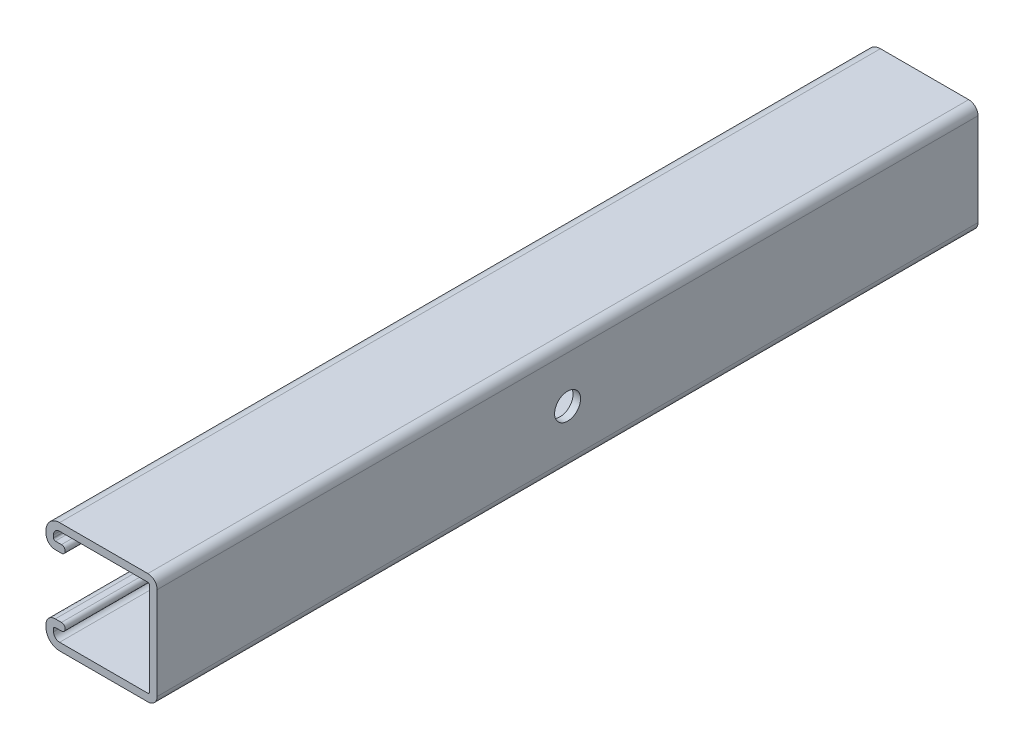
ISO-10303-21;
HEADER;
FILE_DESCRIPTION(('STEP AP214'),'2;1');
FILE_NAME('part.step','',(''),(''),'','','');
FILE_SCHEMA(('AUTOMOTIVE_DESIGN { 1 0 10303 214 1 1 1 1 }'));
ENDSEC;
DATA;
#1=APPLICATION_CONTEXT('core data for automotive mechanical design processes');
#2=APPLICATION_PROTOCOL_DEFINITION('international standard','automotive_design',2000,#1);
#3=PRODUCT_CONTEXT('',#1,'mechanical');
#4=PRODUCT('Part','Part','',(#3));
#5=PRODUCT_RELATED_PRODUCT_CATEGORY('part','',(#4));
#6=PRODUCT_DEFINITION_FORMATION('','',#4);
#7=PRODUCT_DEFINITION_CONTEXT('part definition',#1,'design');
#8=PRODUCT_DEFINITION('design','',#6,#7);
#9=PRODUCT_DEFINITION_SHAPE('','',#8);
#10=(LENGTH_UNIT() NAMED_UNIT(*) SI_UNIT(.MILLI.,.METRE.));
#11=(NAMED_UNIT(*) PLANE_ANGLE_UNIT() SI_UNIT($,.RADIAN.));
#12=(NAMED_UNIT(*) SI_UNIT($,.STERADIAN.) SOLID_ANGLE_UNIT());
#13=UNCERTAINTY_MEASURE_WITH_UNIT(LENGTH_MEASURE(1.E-05),#10,'distance_accuracy_value','');
#14=(GEOMETRIC_REPRESENTATION_CONTEXT(3) GLOBAL_UNCERTAINTY_ASSIGNED_CONTEXT((#13)) GLOBAL_UNIT_ASSIGNED_CONTEXT((#10,
#11,#12)) REPRESENTATION_CONTEXT('',''));
#15=CARTESIAN_POINT('',(0.,0.,0.));
#16=DIRECTION('',(0.,0.,1.));
#17=DIRECTION('',(1.,0.,0.));
#18=AXIS2_PLACEMENT_3D('',#15,#16,#17);
#19=CARTESIAN_POINT('',(-36.22675,15.58925,-304.8));
#20=DIRECTION('',(0.,0.,1.));
#21=DIRECTION('',(1.,0.,0.));
#22=AXIS2_PLACEMENT_3D('',#19,#20,#21);
#23=CYLINDRICAL_SURFACE('',#22,5.04825);
#24=CARTESIAN_POINT('',(-36.22675,15.58925,0.));
#25=DIRECTION('',(0.,0.,1.));
#26=DIRECTION('',(1.,0.,0.));
#27=AXIS2_PLACEMENT_3D('',#24,#25,#26);
#28=CIRCLE('',#27,5.04825);
#29=CARTESIAN_POINT('',(-36.22675,20.6375,0.));
#30=VERTEX_POINT('',#29);
#31=CARTESIAN_POINT('',(-41.275,15.58925,0.));
#32=VERTEX_POINT('',#31);
#33=EDGE_CURVE('E252',#30,#32,#28,.T.);
#34=ORIENTED_EDGE('',*,*,#33,.F.);
#35=DIRECTION('',(0.,0.,1.));
#36=VECTOR('',#35,1.);
#37=CARTESIAN_POINT('',(-36.22675,20.6375,-304.8));
#38=LINE('',#37,#36);
#39=CARTESIAN_POINT('',(-36.22675,20.6375,-304.8));
#40=VERTEX_POINT('',#39);
#41=EDGE_CURVE('E11',#40,#30,#38,.T.);
#42=ORIENTED_EDGE('',*,*,#41,.F.);
#43=CARTESIAN_POINT('',(-36.22675,15.58925,-304.8));
#44=DIRECTION('',(0.,0.,1.));
#45=DIRECTION('',(1.,0.,0.));
#46=AXIS2_PLACEMENT_3D('',#43,#44,#45);
#47=CIRCLE('',#46,5.04825);
#48=CARTESIAN_POINT('',(-41.275,15.58925,-304.8));
#49=VERTEX_POINT('',#48);
#50=EDGE_CURVE('E332',#40,#49,#47,.T.);
#51=ORIENTED_EDGE('',*,*,#50,.T.);
#52=DIRECTION('',(0.,0.,1.));
#53=VECTOR('',#52,1.);
#54=CARTESIAN_POINT('',(-41.275,15.58925,-304.8));
#55=LINE('',#54,#53);
#56=EDGE_CURVE('E150',#49,#32,#55,.T.);
#57=ORIENTED_EDGE('',*,*,#56,.T.);
#58=EDGE_LOOP('',(#34,#42,#51,#57));
#59=FACE_BOUND('',#58,.T.);
#60=ADVANCED_FACE('F34',(#59),#23,.T.);
#61=CARTESIAN_POINT('',(-36.22675,20.6375,-304.8));
#62=DIRECTION('',(0.,1.,0.));
#63=DIRECTION('',(-1.,0.,0.));
#64=AXIS2_PLACEMENT_3D('',#61,#62,#63);
#65=PLANE('',#64);
#66=DIRECTION('',(-1.,0.,0.));
#67=VECTOR('',#66,1.);
#68=CARTESIAN_POINT('',(-36.22675,20.6375,0.));
#69=LINE('',#68,#67);
#70=CARTESIAN_POINT('',(-3.46075,20.6375,0.));
#71=VERTEX_POINT('',#70);
#72=EDGE_CURVE('E330',#71,#30,#69,.T.);
#73=ORIENTED_EDGE('',*,*,#72,.F.);
#74=DIRECTION('',(0.,0.,1.));
#75=VECTOR('',#74,1.);
#76=CARTESIAN_POINT('',(-3.46075,20.6375,-304.8));
#77=LINE('',#76,#75);
#78=CARTESIAN_POINT('',(-3.46075,20.6375,-304.8));
#79=VERTEX_POINT('',#78);
#80=EDGE_CURVE('E43',#79,#71,#77,.T.);
#81=ORIENTED_EDGE('',*,*,#80,.F.);
#82=DIRECTION('',(-1.,0.,0.));
#83=VECTOR('',#82,1.);
#84=CARTESIAN_POINT('',(-36.22675,20.6375,-304.8));
#85=LINE('',#84,#83);
#86=EDGE_CURVE('E242',#79,#40,#85,.T.);
#87=ORIENTED_EDGE('',*,*,#86,.T.);
#88=ORIENTED_EDGE('',*,*,#41,.T.);
#89=EDGE_LOOP('',(#73,#81,#87,#88));
#90=FACE_BOUND('',#89,.T.);
#91=ADVANCED_FACE('F385',(#90),#65,.T.);
#92=CARTESIAN_POINT('',(-3.46075,17.17675,-304.8));
#93=DIRECTION('',(0.,0.,1.));
#94=DIRECTION('',(1.,0.,0.));
#95=AXIS2_PLACEMENT_3D('',#92,#93,#94);
#96=CYLINDRICAL_SURFACE('',#95,3.46075);
#97=CARTESIAN_POINT('',(-3.46075,17.17675,0.));
#98=DIRECTION('',(0.,0.,1.));
#99=DIRECTION('',(1.,0.,0.));
#100=AXIS2_PLACEMENT_3D('',#97,#98,#99);
#101=CIRCLE('',#100,3.46075);
#102=CARTESIAN_POINT('',(0.,17.17675,0.));
#103=VERTEX_POINT('',#102);
#104=EDGE_CURVE('E229',#103,#71,#101,.T.);
#105=ORIENTED_EDGE('',*,*,#104,.F.);
#106=DIRECTION('',(0.,0.,1.));
#107=VECTOR('',#106,1.);
#108=CARTESIAN_POINT('',(0.,17.17675,-304.8));
#109=LINE('',#108,#107);
#110=CARTESIAN_POINT('',(0.,17.17675,-304.8));
#111=VERTEX_POINT('',#110);
#112=EDGE_CURVE('E224',#111,#103,#109,.T.);
#113=ORIENTED_EDGE('',*,*,#112,.F.);
#114=CARTESIAN_POINT('',(-3.46075,17.17675,-304.8));
#115=DIRECTION('',(0.,0.,1.));
#116=DIRECTION('',(1.,0.,0.));
#117=AXIS2_PLACEMENT_3D('',#114,#115,#116);
#118=CIRCLE('',#117,3.46075);
#119=EDGE_CURVE('E227',#111,#79,#118,.T.);
#120=ORIENTED_EDGE('',*,*,#119,.T.);
#121=ORIENTED_EDGE('',*,*,#80,.T.);
#122=EDGE_LOOP('',(#105,#113,#120,#121));
#123=FACE_BOUND('',#122,.T.);
#124=ADVANCED_FACE('F226',(#123),#96,.T.);
#125=CARTESIAN_POINT('',(0.,17.17675,-304.8));
#126=DIRECTION('',(1.,0.,0.));
#127=DIRECTION('',(0.,1.,0.));
#128=AXIS2_PLACEMENT_3D('',#125,#126,#127);
#129=PLANE('',#128);
#130=CARTESIAN_POINT('',(0.,0.,-152.4));
#131=DIRECTION('',(1.,0.,0.));
#132=DIRECTION('',(0.,1.,0.));
#133=AXIS2_PLACEMENT_3D('',#130,#131,#132);
#134=CIRCLE('',#133,4.82599999999999);
#135=CARTESIAN_POINT('',(0.,4.82599999999999,-152.4));
#136=VERTEX_POINT('',#135);
#137=EDGE_CURVE('E508',#136,#136,#134,.T.);
#138=ORIENTED_EDGE('',*,*,#137,.F.);
#139=EDGE_LOOP('',(#138));
#140=FACE_BOUND('',#139,.T.);
#141=DIRECTION('',(0.,1.,0.));
#142=VECTOR('',#141,1.);
#143=CARTESIAN_POINT('',(0.,17.17675,0.));
#144=LINE('',#143,#142);
#145=CARTESIAN_POINT('',(0.,-17.17675,0.));
#146=VERTEX_POINT('',#145);
#147=EDGE_CURVE('E327',#146,#103,#144,.T.);
#148=ORIENTED_EDGE('',*,*,#147,.F.);
#149=DIRECTION('',(0.,0.,1.));
#150=VECTOR('',#149,1.);
#151=CARTESIAN_POINT('',(0.,-17.17675,-304.8));
#152=LINE('',#151,#150);
#153=CARTESIAN_POINT('',(0.,-17.17675,-304.8));
#154=VERTEX_POINT('',#153);
#155=EDGE_CURVE('E234',#154,#146,#152,.T.);
#156=ORIENTED_EDGE('',*,*,#155,.F.);
#157=DIRECTION('',(0.,1.,0.));
#158=VECTOR('',#157,1.);
#159=CARTESIAN_POINT('',(0.,17.17675,-304.8));
#160=LINE('',#159,#158);
#161=EDGE_CURVE('E240',#154,#111,#160,.T.);
#162=ORIENTED_EDGE('',*,*,#161,.T.);
#163=ORIENTED_EDGE('',*,*,#112,.T.);
#164=EDGE_LOOP('',(#148,#156,#162,#163));
#165=FACE_BOUND('',#164,.T.);
#166=ADVANCED_FACE('F244',(#140,#165),#129,.T.);
#167=CARTESIAN_POINT('',(-3.46075,-17.17675,-304.8));
#168=DIRECTION('',(0.,0.,1.));
#169=DIRECTION('',(1.,0.,0.));
#170=AXIS2_PLACEMENT_3D('',#167,#168,#169);
#171=CYLINDRICAL_SURFACE('',#170,3.46075);
#172=CARTESIAN_POINT('',(-3.46075,-17.17675,0.));
#173=DIRECTION('',(0.,0.,1.));
#174=DIRECTION('',(-1.,0.,0.));
#175=AXIS2_PLACEMENT_3D('',#172,#173,#174);
#176=CIRCLE('',#175,3.46075);
#177=CARTESIAN_POINT('',(-3.46075,-20.6375,0.));
#178=VERTEX_POINT('',#177);
#179=EDGE_CURVE('E324',#178,#146,#176,.T.);
#180=ORIENTED_EDGE('',*,*,#179,.F.);
#181=DIRECTION('',(0.,0.,1.));
#182=VECTOR('',#181,1.);
#183=CARTESIAN_POINT('',(-3.46075,-20.6375,-304.8));
#184=LINE('',#183,#182);
#185=CARTESIAN_POINT('',(-3.46075,-20.6375,-304.8));
#186=VERTEX_POINT('',#185);
#187=EDGE_CURVE('E336',#186,#178,#184,.T.);
#188=ORIENTED_EDGE('',*,*,#187,.F.);
#189=CARTESIAN_POINT('',(-3.46075,-17.17675,-304.8));
#190=DIRECTION('',(0.,0.,1.));
#191=DIRECTION('',(-1.,0.,0.));
#192=AXIS2_PLACEMENT_3D('',#189,#190,#191);
#193=CIRCLE('',#192,3.46075);
#194=EDGE_CURVE('E245',#186,#154,#193,.T.);
#195=ORIENTED_EDGE('',*,*,#194,.T.);
#196=ORIENTED_EDGE('',*,*,#155,.T.);
#197=EDGE_LOOP('',(#180,#188,#195,#196));
#198=FACE_BOUND('',#197,.T.);
#199=ADVANCED_FACE('F398',(#198),#171,.T.);
#200=CARTESIAN_POINT('',(-36.22675,-20.6375,-304.8));
#201=DIRECTION('',(0.,-1.,0.));
#202=DIRECTION('',(1.,0.,0.));
#203=AXIS2_PLACEMENT_3D('',#200,#201,#202);
#204=PLANE('',#203);
#205=DIRECTION('',(1.,0.,0.));
#206=VECTOR('',#205,1.);
#207=CARTESIAN_POINT('',(-36.22675,-20.6375,0.));
#208=LINE('',#207,#206);
#209=CARTESIAN_POINT('',(-36.22675,-20.6375,0.));
#210=VERTEX_POINT('',#209);
#211=EDGE_CURVE('E321',#210,#178,#208,.T.);
#212=ORIENTED_EDGE('',*,*,#211,.F.);
#213=DIRECTION('',(0.,0.,1.));
#214=VECTOR('',#213,1.);
#215=CARTESIAN_POINT('',(-36.22675,-20.6375,-304.8));
#216=LINE('',#215,#214);
#217=CARTESIAN_POINT('',(-36.22675,-20.6375,-304.8));
#218=VERTEX_POINT('',#217);
#219=EDGE_CURVE('E338',#218,#210,#216,.T.);
#220=ORIENTED_EDGE('',*,*,#219,.F.);
#221=DIRECTION('',(1.,0.,0.));
#222=VECTOR('',#221,1.);
#223=CARTESIAN_POINT('',(-36.22675,-20.6375,-304.8));
#224=LINE('',#223,#222);
#225=EDGE_CURVE('E247',#218,#186,#224,.T.);
#226=ORIENTED_EDGE('',*,*,#225,.T.);
#227=ORIENTED_EDGE('',*,*,#187,.T.);
#228=EDGE_LOOP('',(#212,#220,#226,#227));
#229=FACE_BOUND('',#228,.T.);
#230=ADVANCED_FACE('F402',(#229),#204,.T.);
#231=CARTESIAN_POINT('',(-36.22675,-15.58925,-304.8));
#232=DIRECTION('',(0.,0.,1.));
#233=DIRECTION('',(1.,0.,0.));
#234=AXIS2_PLACEMENT_3D('',#231,#232,#233);
#235=CYLINDRICAL_SURFACE('',#234,5.04825);
#236=CARTESIAN_POINT('',(-36.22675,-15.58925,0.));
#237=DIRECTION('',(0.,0.,1.));
#238=DIRECTION('',(-1.,0.,0.));
#239=AXIS2_PLACEMENT_3D('',#236,#237,#238);
#240=CIRCLE('',#239,5.04825);
#241=CARTESIAN_POINT('',(-41.275,-15.58925,0.));
#242=VERTEX_POINT('',#241);
#243=EDGE_CURVE('E318',#242,#210,#240,.T.);
#244=ORIENTED_EDGE('',*,*,#243,.F.);
#245=DIRECTION('',(0.,0.,1.));
#246=VECTOR('',#245,1.);
#247=CARTESIAN_POINT('',(-41.275,-15.58925,-304.8));
#248=LINE('',#247,#246);
#249=CARTESIAN_POINT('',(-41.275,-15.58925,-304.8));
#250=VERTEX_POINT('',#249);
#251=EDGE_CURVE('E340',#250,#242,#248,.T.);
#252=ORIENTED_EDGE('',*,*,#251,.F.);
#253=CARTESIAN_POINT('',(-36.22675,-15.58925,-304.8));
#254=DIRECTION('',(0.,0.,1.));
#255=DIRECTION('',(-1.,0.,0.));
#256=AXIS2_PLACEMENT_3D('',#253,#254,#255);
#257=CIRCLE('',#256,5.04825);
#258=EDGE_CURVE('E574',#250,#218,#257,.T.);
#259=ORIENTED_EDGE('',*,*,#258,.T.);
#260=ORIENTED_EDGE('',*,*,#219,.T.);
#261=EDGE_LOOP('',(#244,#252,#259,#260));
#262=FACE_BOUND('',#261,.T.);
#263=ADVANCED_FACE('F406',(#262),#235,.T.);
#264=CARTESIAN_POINT('',(-41.275,-15.58925,-304.8));
#265=DIRECTION('',(-1.,0.,0.));
#266=DIRECTION('',(0.,0.,1.));
#267=AXIS2_PLACEMENT_3D('',#264,#265,#266);
#268=PLANE('',#267);
#269=DIRECTION('',(0.,-1.,0.));
#270=VECTOR('',#269,1.);
#271=CARTESIAN_POINT('',(-41.275,-15.58925,0.));
#272=LINE('',#271,#270);
#273=CARTESIAN_POINT('',(-41.275,-14.57325,0.));
#274=VERTEX_POINT('',#273);
#275=EDGE_CURVE('E315',#274,#242,#272,.T.);
#276=ORIENTED_EDGE('',*,*,#275,.F.);
#277=DIRECTION('',(0.,0.,1.));
#278=VECTOR('',#277,1.);
#279=CARTESIAN_POINT('',(-41.275,-14.57325,-304.8));
#280=LINE('',#279,#278);
#281=CARTESIAN_POINT('',(-41.275,-14.57325,-304.8));
#282=VERTEX_POINT('',#281);
#283=EDGE_CURVE('E342',#282,#274,#280,.T.);
#284=ORIENTED_EDGE('',*,*,#283,.F.);
#285=DIRECTION('',(0.,-1.,0.));
#286=VECTOR('',#285,1.);
#287=CARTESIAN_POINT('',(-41.275,-15.58925,-304.8));
#288=LINE('',#287,#286);
#289=EDGE_CURVE('E571',#282,#250,#288,.T.);
#290=ORIENTED_EDGE('',*,*,#289,.T.);
#291=ORIENTED_EDGE('',*,*,#251,.T.);
#292=EDGE_LOOP('',(#276,#284,#290,#291));
#293=FACE_BOUND('',#292,.T.);
#294=ADVANCED_FACE('F410',(#293),#268,.T.);
#295=CARTESIAN_POINT('',(-37.81425,-14.57325,-304.8));
#296=DIRECTION('',(0.,0.,1.));
#297=DIRECTION('',(1.,0.,0.));
#298=AXIS2_PLACEMENT_3D('',#295,#296,#297);
#299=CYLINDRICAL_SURFACE('',#298,3.46075);
#300=CARTESIAN_POINT('',(-37.81425,-14.57325,0.));
#301=DIRECTION('',(0.,0.,1.));
#302=DIRECTION('',(-1.,0.,0.));
#303=AXIS2_PLACEMENT_3D('',#300,#301,#302);
#304=CIRCLE('',#303,3.46075);
#305=CARTESIAN_POINT('',(-37.81425,-11.1125,0.));
#306=VERTEX_POINT('',#305);
#307=EDGE_CURVE('E312',#306,#274,#304,.T.);
#308=ORIENTED_EDGE('',*,*,#307,.F.);
#309=DIRECTION('',(0.,0.,1.));
#310=VECTOR('',#309,1.);
#311=CARTESIAN_POINT('',(-37.81425,-11.1125,-304.8));
#312=LINE('',#311,#310);
#313=CARTESIAN_POINT('',(-37.81425,-11.1125,-304.8));
#314=VERTEX_POINT('',#313);
#315=EDGE_CURVE('E344',#314,#306,#312,.T.);
#316=ORIENTED_EDGE('',*,*,#315,.F.);
#317=CARTESIAN_POINT('',(-37.81425,-14.57325,-304.8));
#318=DIRECTION('',(0.,0.,1.));
#319=DIRECTION('',(-1.,0.,0.));
#320=AXIS2_PLACEMENT_3D('',#317,#318,#319);
#321=CIRCLE('',#320,3.46075);
#322=EDGE_CURVE('E568',#314,#282,#321,.T.);
#323=ORIENTED_EDGE('',*,*,#322,.T.);
#324=ORIENTED_EDGE('',*,*,#283,.T.);
#325=EDGE_LOOP('',(#308,#316,#323,#324));
#326=FACE_BOUND('',#325,.T.);
#327=ADVANCED_FACE('F414',(#326),#299,.T.);
#328=CARTESIAN_POINT('',(-37.81425,-11.1125,-304.8));
#329=DIRECTION('',(0.,1.,0.));
#330=DIRECTION('',(-1.,0.,0.));
#331=AXIS2_PLACEMENT_3D('',#328,#329,#330);
#332=PLANE('',#331);
#333=DIRECTION('',(-1.,0.,0.));
#334=VECTOR('',#333,1.);
#335=CARTESIAN_POINT('',(-37.81425,-11.1125,0.));
#336=LINE('',#335,#334);
#337=CARTESIAN_POINT('',(-35.5346,-11.1125,0.));
#338=VERTEX_POINT('',#337);
#339=EDGE_CURVE('E309',#338,#306,#336,.T.);
#340=ORIENTED_EDGE('',*,*,#339,.F.);
#341=DIRECTION('',(0.,0.,1.));
#342=VECTOR('',#341,1.);
#343=CARTESIAN_POINT('',(-35.5346,-11.1125,-304.8));
#344=LINE('',#343,#342);
#345=CARTESIAN_POINT('',(-35.5346,-11.1125,-304.8));
#346=VERTEX_POINT('',#345);
#347=EDGE_CURVE('E346',#346,#338,#344,.T.);
#348=ORIENTED_EDGE('',*,*,#347,.F.);
#349=DIRECTION('',(-1.,0.,0.));
#350=VECTOR('',#349,1.);
#351=CARTESIAN_POINT('',(-37.81425,-11.1125,-304.8));
#352=LINE('',#351,#350);
#353=EDGE_CURVE('E565',#346,#314,#352,.T.);
#354=ORIENTED_EDGE('',*,*,#353,.T.);
#355=ORIENTED_EDGE('',*,*,#315,.T.);
#356=EDGE_LOOP('',(#340,#348,#354,#355));
#357=FACE_BOUND('',#356,.T.);
#358=ADVANCED_FACE('F418',(#357),#332,.T.);
#359=CARTESIAN_POINT('',(-35.5346,-12.5095,-304.8));
#360=DIRECTION('',(0.,0.,1.));
#361=DIRECTION('',(1.,0.,0.));
#362=AXIS2_PLACEMENT_3D('',#359,#360,#361);
#363=CYLINDRICAL_SURFACE('',#362,1.397);
#364=CARTESIAN_POINT('',(-35.5346,-12.5095,0.));
#365=DIRECTION('',(0.,0.,1.));
#366=DIRECTION('',(-1.,0.,0.));
#367=AXIS2_PLACEMENT_3D('',#364,#365,#366);
#368=CIRCLE('',#367,1.397);
#369=CARTESIAN_POINT('',(-35.5346,-13.9065,0.));
#370=VERTEX_POINT('',#369);
#371=EDGE_CURVE('E306',#370,#338,#368,.T.);
#372=ORIENTED_EDGE('',*,*,#371,.F.);
#373=DIRECTION('',(0.,0.,1.));
#374=VECTOR('',#373,1.);
#375=CARTESIAN_POINT('',(-35.5346,-13.9065,-304.8));
#376=LINE('',#375,#374);
#377=CARTESIAN_POINT('',(-35.5346,-13.9065,-304.8));
#378=VERTEX_POINT('',#377);
#379=EDGE_CURVE('E348',#378,#370,#376,.T.);
#380=ORIENTED_EDGE('',*,*,#379,.F.);
#381=CARTESIAN_POINT('',(-35.5346,-12.5095,-304.8));
#382=DIRECTION('',(0.,0.,1.));
#383=DIRECTION('',(-1.,0.,0.));
#384=AXIS2_PLACEMENT_3D('',#381,#382,#383);
#385=CIRCLE('',#384,1.397);
#386=EDGE_CURVE('E562',#378,#346,#385,.T.);
#387=ORIENTED_EDGE('',*,*,#386,.T.);
#388=ORIENTED_EDGE('',*,*,#347,.T.);
#389=EDGE_LOOP('',(#372,#380,#387,#388));
#390=FACE_BOUND('',#389,.T.);
#391=ADVANCED_FACE('F422',(#390),#363,.T.);
#392=CARTESIAN_POINT('',(-35.5346,-13.9065,-304.8));
#393=DIRECTION('',(0.,-1.,0.));
#394=DIRECTION('',(1.,0.,0.));
#395=AXIS2_PLACEMENT_3D('',#392,#393,#394);
#396=PLANE('',#395);
#397=DIRECTION('',(1.,0.,0.));
#398=VECTOR('',#397,1.);
#399=CARTESIAN_POINT('',(-35.5346,-13.9065,0.));
#400=LINE('',#399,#398);
#401=CARTESIAN_POINT('',(-37.81425,-13.9065,0.));
#402=VERTEX_POINT('',#401);
#403=EDGE_CURVE('E303',#402,#370,#400,.T.);
#404=ORIENTED_EDGE('',*,*,#403,.F.);
#405=DIRECTION('',(0.,0.,1.));
#406=VECTOR('',#405,1.);
#407=CARTESIAN_POINT('',(-37.81425,-13.9065,-304.8));
#408=LINE('',#407,#406);
#409=CARTESIAN_POINT('',(-37.81425,-13.9065,-304.8));
#410=VERTEX_POINT('',#409);
#411=EDGE_CURVE('E350',#410,#402,#408,.T.);
#412=ORIENTED_EDGE('',*,*,#411,.F.);
#413=DIRECTION('',(1.,0.,0.));
#414=VECTOR('',#413,1.);
#415=CARTESIAN_POINT('',(-35.5346,-13.9065,-304.8));
#416=LINE('',#415,#414);
#417=EDGE_CURVE('E559',#410,#378,#416,.T.);
#418=ORIENTED_EDGE('',*,*,#417,.T.);
#419=ORIENTED_EDGE('',*,*,#379,.T.);
#420=EDGE_LOOP('',(#404,#412,#418,#419));
#421=FACE_BOUND('',#420,.T.);
#422=ADVANCED_FACE('F426',(#421),#396,.T.);
#423=CARTESIAN_POINT('',(-37.81425,-14.57325,-304.8));
#424=DIRECTION('',(0.,0.,1.));
#425=DIRECTION('',(1.,0.,0.));
#426=AXIS2_PLACEMENT_3D('',#423,#424,#425);
#427=CYLINDRICAL_SURFACE('',#426,0.666750000000008);
#428=CARTESIAN_POINT('',(-37.81425,-14.57325,0.));
#429=DIRECTION('',(0.,0.,-1.));
#430=DIRECTION('',(1.,0.,0.));
#431=AXIS2_PLACEMENT_3D('',#428,#429,#430);
#432=CIRCLE('',#431,0.666750000000008);
#433=CARTESIAN_POINT('',(-38.481,-14.57325,0.));
#434=VERTEX_POINT('',#433);
#435=EDGE_CURVE('E300',#434,#402,#432,.T.);
#436=ORIENTED_EDGE('',*,*,#435,.F.);
#437=DIRECTION('',(0.,0.,1.));
#438=VECTOR('',#437,1.);
#439=CARTESIAN_POINT('',(-38.481,-14.57325,-304.8));
#440=LINE('',#439,#438);
#441=CARTESIAN_POINT('',(-38.481,-14.57325,-304.8));
#442=VERTEX_POINT('',#441);
#443=EDGE_CURVE('E352',#442,#434,#440,.T.);
#444=ORIENTED_EDGE('',*,*,#443,.F.);
#445=CARTESIAN_POINT('',(-37.81425,-14.57325,-304.8));
#446=DIRECTION('',(0.,0.,-1.));
#447=DIRECTION('',(1.,0.,0.));
#448=AXIS2_PLACEMENT_3D('',#445,#446,#447);
#449=CIRCLE('',#448,0.666750000000008);
#450=EDGE_CURVE('E556',#442,#410,#449,.T.);
#451=ORIENTED_EDGE('',*,*,#450,.T.);
#452=ORIENTED_EDGE('',*,*,#411,.T.);
#453=EDGE_LOOP('',(#436,#444,#451,#452));
#454=FACE_BOUND('',#453,.T.);
#455=ADVANCED_FACE('F430',(#454),#427,.F.);
#456=CARTESIAN_POINT('',(-38.481,-14.57325,-304.8));
#457=DIRECTION('',(1.,0.,0.));
#458=DIRECTION('',(0.,1.,0.));
#459=AXIS2_PLACEMENT_3D('',#456,#457,#458);
#460=PLANE('',#459);
#461=DIRECTION('',(0.,1.,0.));
#462=VECTOR('',#461,1.);
#463=CARTESIAN_POINT('',(-38.481,-14.57325,0.));
#464=LINE('',#463,#462);
#465=CARTESIAN_POINT('',(-38.481,-15.58925,0.));
#466=VERTEX_POINT('',#465);
#467=EDGE_CURVE('E297',#466,#434,#464,.T.);
#468=ORIENTED_EDGE('',*,*,#467,.F.);
#469=DIRECTION('',(0.,0.,1.));
#470=VECTOR('',#469,1.);
#471=CARTESIAN_POINT('',(-38.481,-15.58925,-304.8));
#472=LINE('',#471,#470);
#473=CARTESIAN_POINT('',(-38.481,-15.58925,-304.8));
#474=VERTEX_POINT('',#473);
#475=EDGE_CURVE('E354',#474,#466,#472,.T.);
#476=ORIENTED_EDGE('',*,*,#475,.F.);
#477=DIRECTION('',(0.,1.,0.));
#478=VECTOR('',#477,1.);
#479=CARTESIAN_POINT('',(-38.481,-14.57325,-304.8));
#480=LINE('',#479,#478);
#481=EDGE_CURVE('E553',#474,#442,#480,.T.);
#482=ORIENTED_EDGE('',*,*,#481,.T.);
#483=ORIENTED_EDGE('',*,*,#443,.T.);
#484=EDGE_LOOP('',(#468,#476,#482,#483));
#485=FACE_BOUND('',#484,.T.);
#486=ADVANCED_FACE('F434',(#485),#460,.T.);
#487=CARTESIAN_POINT('',(-36.22675,-15.58925,-304.8));
#488=DIRECTION('',(0.,0.,1.));
#489=DIRECTION('',(1.,0.,0.));
#490=AXIS2_PLACEMENT_3D('',#487,#488,#489);
#491=CYLINDRICAL_SURFACE('',#490,2.25425);
#492=CARTESIAN_POINT('',(-36.22675,-15.58925,0.));
#493=DIRECTION('',(0.,0.,-1.));
#494=DIRECTION('',(1.,0.,0.));
#495=AXIS2_PLACEMENT_3D('',#492,#493,#494);
#496=CIRCLE('',#495,2.25425);
#497=CARTESIAN_POINT('',(-36.22675,-17.8435,0.));
#498=VERTEX_POINT('',#497);
#499=EDGE_CURVE('E294',#498,#466,#496,.T.);
#500=ORIENTED_EDGE('',*,*,#499,.F.);
#501=DIRECTION('',(0.,0.,1.));
#502=VECTOR('',#501,1.);
#503=CARTESIAN_POINT('',(-36.22675,-17.8435,-304.8));
#504=LINE('',#503,#502);
#505=CARTESIAN_POINT('',(-36.22675,-17.8435,-304.8));
#506=VERTEX_POINT('',#505);
#507=EDGE_CURVE('E356',#506,#498,#504,.T.);
#508=ORIENTED_EDGE('',*,*,#507,.F.);
#509=CARTESIAN_POINT('',(-36.22675,-15.58925,-304.8));
#510=DIRECTION('',(0.,0.,-1.));
#511=DIRECTION('',(1.,0.,0.));
#512=AXIS2_PLACEMENT_3D('',#509,#510,#511);
#513=CIRCLE('',#512,2.25425);
#514=EDGE_CURVE('E550',#506,#474,#513,.T.);
#515=ORIENTED_EDGE('',*,*,#514,.T.);
#516=ORIENTED_EDGE('',*,*,#475,.T.);
#517=EDGE_LOOP('',(#500,#508,#515,#516));
#518=FACE_BOUND('',#517,.T.);
#519=ADVANCED_FACE('F438',(#518),#491,.F.);
#520=CARTESIAN_POINT('',(-3.46075,-17.8435,-304.8));
#521=DIRECTION('',(0.,1.,0.));
#522=DIRECTION('',(-1.,0.,0.));
#523=AXIS2_PLACEMENT_3D('',#520,#521,#522);
#524=PLANE('',#523);
#525=DIRECTION('',(-1.,0.,0.));
#526=VECTOR('',#525,1.);
#527=CARTESIAN_POINT('',(-3.46075,-17.8435,0.));
#528=LINE('',#527,#526);
#529=CARTESIAN_POINT('',(-3.46075,-17.8435,0.));
#530=VERTEX_POINT('',#529);
#531=EDGE_CURVE('E291',#530,#498,#528,.T.);
#532=ORIENTED_EDGE('',*,*,#531,.F.);
#533=DIRECTION('',(0.,0.,1.));
#534=VECTOR('',#533,1.);
#535=CARTESIAN_POINT('',(-3.46075,-17.8435,-304.8));
#536=LINE('',#535,#534);
#537=CARTESIAN_POINT('',(-3.46075,-17.8435,-304.8));
#538=VERTEX_POINT('',#537);
#539=EDGE_CURVE('E358',#538,#530,#536,.T.);
#540=ORIENTED_EDGE('',*,*,#539,.F.);
#541=DIRECTION('',(-1.,0.,0.));
#542=VECTOR('',#541,1.);
#543=CARTESIAN_POINT('',(-3.46075,-17.8435,-304.8));
#544=LINE('',#543,#542);
#545=EDGE_CURVE('E547',#538,#506,#544,.T.);
#546=ORIENTED_EDGE('',*,*,#545,.T.);
#547=ORIENTED_EDGE('',*,*,#507,.T.);
#548=EDGE_LOOP('',(#532,#540,#546,#547));
#549=FACE_BOUND('',#548,.T.);
#550=ADVANCED_FACE('F442',(#549),#524,.T.);
#551=CARTESIAN_POINT('',(-3.46075,-17.17675,-304.8));
#552=DIRECTION('',(0.,0.,1.));
#553=DIRECTION('',(1.,0.,0.));
#554=AXIS2_PLACEMENT_3D('',#551,#552,#553);
#555=CYLINDRICAL_SURFACE('',#554,0.666750000000004);
#556=CARTESIAN_POINT('',(-3.46075,-17.17675,0.));
#557=DIRECTION('',(0.,0.,-1.));
#558=DIRECTION('',(-1.,0.,0.));
#559=AXIS2_PLACEMENT_3D('',#556,#557,#558);
#560=CIRCLE('',#559,0.666750000000004);
#561=CARTESIAN_POINT('',(-2.79399999999999,-17.17675,0.));
#562=VERTEX_POINT('',#561);
#563=EDGE_CURVE('E288',#562,#530,#560,.T.);
#564=ORIENTED_EDGE('',*,*,#563,.F.);
#565=DIRECTION('',(0.,0.,1.));
#566=VECTOR('',#565,1.);
#567=CARTESIAN_POINT('',(-2.79399999999999,-17.17675,-304.8));
#568=LINE('',#567,#566);
#569=CARTESIAN_POINT('',(-2.79399999999999,-17.17675,-304.8));
#570=VERTEX_POINT('',#569);
#571=EDGE_CURVE('E360',#570,#562,#568,.T.);
#572=ORIENTED_EDGE('',*,*,#571,.F.);
#573=CARTESIAN_POINT('',(-3.46075,-17.17675,-304.8));
#574=DIRECTION('',(0.,0.,-1.));
#575=DIRECTION('',(-1.,0.,0.));
#576=AXIS2_PLACEMENT_3D('',#573,#574,#575);
#577=CIRCLE('',#576,0.666750000000004);
#578=EDGE_CURVE('E544',#570,#538,#577,.T.);
#579=ORIENTED_EDGE('',*,*,#578,.T.);
#580=ORIENTED_EDGE('',*,*,#539,.T.);
#581=EDGE_LOOP('',(#564,#572,#579,#580));
#582=FACE_BOUND('',#581,.T.);
#583=ADVANCED_FACE('F446',(#582),#555,.F.);
#584=CARTESIAN_POINT('',(-2.79399999999999,-17.17675,-304.8));
#585=DIRECTION('',(-1.,0.,0.));
#586=DIRECTION('',(0.,-1.,0.));
#587=AXIS2_PLACEMENT_3D('',#584,#585,#586);
#588=PLANE('',#587);
#589=CARTESIAN_POINT('',(-2.794,0.,-152.4));
#590=DIRECTION('',(-1.,0.,0.));
#591=DIRECTION('',(0.,-1.,0.));
#592=AXIS2_PLACEMENT_3D('',#589,#590,#591);
#593=CIRCLE('',#592,4.82599999999999);
#594=CARTESIAN_POINT('',(-2.794,-4.82599999999999,-152.4));
#595=VERTEX_POINT('',#594);
#596=EDGE_CURVE('E37',#595,#595,#593,.T.);
#597=ORIENTED_EDGE('',*,*,#596,.F.);
#598=EDGE_LOOP('',(#597));
#599=FACE_BOUND('',#598,.T.);
#600=DIRECTION('',(0.,-1.,0.));
#601=VECTOR('',#600,1.);
#602=CARTESIAN_POINT('',(-2.79399999999999,-17.17675,0.));
#603=LINE('',#602,#601);
#604=CARTESIAN_POINT('',(-2.794,17.17675,0.));
#605=VERTEX_POINT('',#604);
#606=EDGE_CURVE('E285',#605,#562,#603,.T.);
#607=ORIENTED_EDGE('',*,*,#606,.F.);
#608=DIRECTION('',(0.,0.,1.));
#609=VECTOR('',#608,1.);
#610=CARTESIAN_POINT('',(-2.794,17.17675,-304.8));
#611=LINE('',#610,#609);
#612=CARTESIAN_POINT('',(-2.794,17.17675,-304.8));
#613=VERTEX_POINT('',#612);
#614=EDGE_CURVE('E362',#613,#605,#611,.T.);
#615=ORIENTED_EDGE('',*,*,#614,.F.);
#616=DIRECTION('',(0.,-1.,0.));
#617=VECTOR('',#616,1.);
#618=CARTESIAN_POINT('',(-2.79399999999999,-17.17675,-304.8));
#619=LINE('',#618,#617);
#620=EDGE_CURVE('E541',#613,#570,#619,.T.);
#621=ORIENTED_EDGE('',*,*,#620,.T.);
#622=ORIENTED_EDGE('',*,*,#571,.T.);
#623=EDGE_LOOP('',(#607,#615,#621,#622));
#624=FACE_BOUND('',#623,.T.);
#625=ADVANCED_FACE('F450',(#599,#624),#588,.T.);
#626=CARTESIAN_POINT('',(-3.46075,17.17675,-304.8));
#627=DIRECTION('',(0.,0.,1.));
#628=DIRECTION('',(1.,0.,0.));
#629=AXIS2_PLACEMENT_3D('',#626,#627,#628);
#630=CYLINDRICAL_SURFACE('',#629,0.666750000000004);
#631=CARTESIAN_POINT('',(-3.46075,17.17675,0.));
#632=DIRECTION('',(0.,0.,-1.));
#633=DIRECTION('',(1.,0.,0.));
#634=AXIS2_PLACEMENT_3D('',#631,#632,#633);
#635=CIRCLE('',#634,0.666750000000004);
#636=CARTESIAN_POINT('',(-3.46075,17.8435,0.));
#637=VERTEX_POINT('',#636);
#638=EDGE_CURVE('E282',#637,#605,#635,.T.);
#639=ORIENTED_EDGE('',*,*,#638,.F.);
#640=DIRECTION('',(0.,0.,1.));
#641=VECTOR('',#640,1.);
#642=CARTESIAN_POINT('',(-3.46075,17.8435,-304.8));
#643=LINE('',#642,#641);
#644=CARTESIAN_POINT('',(-3.46075,17.8435,-304.8));
#645=VERTEX_POINT('',#644);
#646=EDGE_CURVE('E364',#645,#637,#643,.T.);
#647=ORIENTED_EDGE('',*,*,#646,.F.);
#648=CARTESIAN_POINT('',(-3.46075,17.17675,-304.8));
#649=DIRECTION('',(0.,0.,-1.));
#650=DIRECTION('',(1.,0.,0.));
#651=AXIS2_PLACEMENT_3D('',#648,#649,#650);
#652=CIRCLE('',#651,0.666750000000004);
#653=EDGE_CURVE('E538',#645,#613,#652,.T.);
#654=ORIENTED_EDGE('',*,*,#653,.T.);
#655=ORIENTED_EDGE('',*,*,#614,.T.);
#656=EDGE_LOOP('',(#639,#647,#654,#655));
#657=FACE_BOUND('',#656,.T.);
#658=ADVANCED_FACE('F454',(#657),#630,.F.);
#659=CARTESIAN_POINT('',(-3.46075,17.8435,-304.8));
#660=DIRECTION('',(0.,-1.,0.));
#661=DIRECTION('',(1.,0.,0.));
#662=AXIS2_PLACEMENT_3D('',#659,#660,#661);
#663=PLANE('',#662);
#664=DIRECTION('',(1.,0.,0.));
#665=VECTOR('',#664,1.);
#666=CARTESIAN_POINT('',(-3.46075,17.8435,0.));
#667=LINE('',#666,#665);
#668=CARTESIAN_POINT('',(-36.22675,17.8435,0.));
#669=VERTEX_POINT('',#668);
#670=EDGE_CURVE('E279',#669,#637,#667,.T.);
#671=ORIENTED_EDGE('',*,*,#670,.F.);
#672=DIRECTION('',(0.,0.,1.));
#673=VECTOR('',#672,1.);
#674=CARTESIAN_POINT('',(-36.22675,17.8435,-304.8));
#675=LINE('',#674,#673);
#676=CARTESIAN_POINT('',(-36.22675,17.8435,-304.8));
#677=VERTEX_POINT('',#676);
#678=EDGE_CURVE('E366',#677,#669,#675,.T.);
#679=ORIENTED_EDGE('',*,*,#678,.F.);
#680=DIRECTION('',(1.,0.,0.));
#681=VECTOR('',#680,1.);
#682=CARTESIAN_POINT('',(-3.46075,17.8435,-304.8));
#683=LINE('',#682,#681);
#684=EDGE_CURVE('E535',#677,#645,#683,.T.);
#685=ORIENTED_EDGE('',*,*,#684,.T.);
#686=ORIENTED_EDGE('',*,*,#646,.T.);
#687=EDGE_LOOP('',(#671,#679,#685,#686));
#688=FACE_BOUND('',#687,.T.);
#689=ADVANCED_FACE('F458',(#688),#663,.T.);
#690=CARTESIAN_POINT('',(-36.22675,15.58925,-304.8));
#691=DIRECTION('',(0.,0.,1.));
#692=DIRECTION('',(1.,0.,0.));
#693=AXIS2_PLACEMENT_3D('',#690,#691,#692);
#694=CYLINDRICAL_SURFACE('',#693,2.25425);
#695=CARTESIAN_POINT('',(-36.22675,15.58925,0.));
#696=DIRECTION('',(0.,0.,-1.));
#697=DIRECTION('',(-1.,0.,0.));
#698=AXIS2_PLACEMENT_3D('',#695,#696,#697);
#699=CIRCLE('',#698,2.25425);
#700=CARTESIAN_POINT('',(-38.481,15.58925,0.));
#701=VERTEX_POINT('',#700);
#702=EDGE_CURVE('E276',#701,#669,#699,.T.);
#703=ORIENTED_EDGE('',*,*,#702,.F.);
#704=DIRECTION('',(0.,0.,1.));
#705=VECTOR('',#704,1.);
#706=CARTESIAN_POINT('',(-38.481,15.58925,-304.8));
#707=LINE('',#706,#705);
#708=CARTESIAN_POINT('',(-38.481,15.58925,-304.8));
#709=VERTEX_POINT('',#708);
#710=EDGE_CURVE('E368',#709,#701,#707,.T.);
#711=ORIENTED_EDGE('',*,*,#710,.F.);
#712=CARTESIAN_POINT('',(-36.22675,15.58925,-304.8));
#713=DIRECTION('',(0.,0.,-1.));
#714=DIRECTION('',(-1.,0.,0.));
#715=AXIS2_PLACEMENT_3D('',#712,#713,#714);
#716=CIRCLE('',#715,2.25425);
#717=EDGE_CURVE('E532',#709,#677,#716,.T.);
#718=ORIENTED_EDGE('',*,*,#717,.T.);
#719=ORIENTED_EDGE('',*,*,#678,.T.);
#720=EDGE_LOOP('',(#703,#711,#718,#719));
#721=FACE_BOUND('',#720,.T.);
#722=ADVANCED_FACE('F462',(#721),#694,.F.);
#723=CARTESIAN_POINT('',(-38.481,14.57325,-304.8));
#724=DIRECTION('',(1.,0.,0.));
#725=DIRECTION('',(0.,1.,0.));
#726=AXIS2_PLACEMENT_3D('',#723,#724,#725);
#727=PLANE('',#726);
#728=DIRECTION('',(0.,1.,0.));
#729=VECTOR('',#728,1.);
#730=CARTESIAN_POINT('',(-38.481,14.57325,0.));
#731=LINE('',#730,#729);
#732=CARTESIAN_POINT('',(-38.481,14.57325,0.));
#733=VERTEX_POINT('',#732);
#734=EDGE_CURVE('E273',#733,#701,#731,.T.);
#735=ORIENTED_EDGE('',*,*,#734,.F.);
#736=DIRECTION('',(0.,0.,1.));
#737=VECTOR('',#736,1.);
#738=CARTESIAN_POINT('',(-38.481,14.57325,-304.8));
#739=LINE('',#738,#737);
#740=CARTESIAN_POINT('',(-38.481,14.57325,-304.8));
#741=VERTEX_POINT('',#740);
#742=EDGE_CURVE('E370',#741,#733,#739,.T.);
#743=ORIENTED_EDGE('',*,*,#742,.F.);
#744=DIRECTION('',(0.,1.,0.));
#745=VECTOR('',#744,1.);
#746=CARTESIAN_POINT('',(-38.481,14.57325,-304.8));
#747=LINE('',#746,#745);
#748=EDGE_CURVE('E529',#741,#709,#747,.T.);
#749=ORIENTED_EDGE('',*,*,#748,.T.);
#750=ORIENTED_EDGE('',*,*,#710,.T.);
#751=EDGE_LOOP('',(#735,#743,#749,#750));
#752=FACE_BOUND('',#751,.T.);
#753=ADVANCED_FACE('F466',(#752),#727,.T.);
#754=CARTESIAN_POINT('',(-37.81425,14.57325,-304.8));
#755=DIRECTION('',(0.,0.,1.));
#756=DIRECTION('',(1.,0.,0.));
#757=AXIS2_PLACEMENT_3D('',#754,#755,#756);
#758=CYLINDRICAL_SURFACE('',#757,0.666750000000008);
#759=CARTESIAN_POINT('',(-37.81425,14.57325,0.));
#760=DIRECTION('',(0.,0.,-1.));
#761=DIRECTION('',(-1.,0.,0.));
#762=AXIS2_PLACEMENT_3D('',#759,#760,#761);
#763=CIRCLE('',#762,0.666750000000008);
#764=CARTESIAN_POINT('',(-37.81425,13.9065,0.));
#765=VERTEX_POINT('',#764);
#766=EDGE_CURVE('E270',#765,#733,#763,.T.);
#767=ORIENTED_EDGE('',*,*,#766,.F.);
#768=DIRECTION('',(0.,0.,1.));
#769=VECTOR('',#768,1.);
#770=CARTESIAN_POINT('',(-37.81425,13.9065,-304.8));
#771=LINE('',#770,#769);
#772=CARTESIAN_POINT('',(-37.81425,13.9065,-304.8));
#773=VERTEX_POINT('',#772);
#774=EDGE_CURVE('E372',#773,#765,#771,.T.);
#775=ORIENTED_EDGE('',*,*,#774,.F.);
#776=CARTESIAN_POINT('',(-37.81425,14.57325,-304.8));
#777=DIRECTION('',(0.,0.,-1.));
#778=DIRECTION('',(-1.,0.,0.));
#779=AXIS2_PLACEMENT_3D('',#776,#777,#778);
#780=CIRCLE('',#779,0.666750000000008);
#781=EDGE_CURVE('E526',#773,#741,#780,.T.);
#782=ORIENTED_EDGE('',*,*,#781,.T.);
#783=ORIENTED_EDGE('',*,*,#742,.T.);
#784=EDGE_LOOP('',(#767,#775,#782,#783));
#785=FACE_BOUND('',#784,.T.);
#786=ADVANCED_FACE('F470',(#785),#758,.F.);
#787=CARTESIAN_POINT('',(-35.5346,13.9065,-304.8));
#788=DIRECTION('',(0.,1.,0.));
#789=DIRECTION('',(-1.,0.,0.));
#790=AXIS2_PLACEMENT_3D('',#787,#788,#789);
#791=PLANE('',#790);
#792=DIRECTION('',(-1.,0.,0.));
#793=VECTOR('',#792,1.);
#794=CARTESIAN_POINT('',(-35.5346,13.9065,0.));
#795=LINE('',#794,#793);
#796=CARTESIAN_POINT('',(-35.5346,13.9065,0.));
#797=VERTEX_POINT('',#796);
#798=EDGE_CURVE('E267',#797,#765,#795,.T.);
#799=ORIENTED_EDGE('',*,*,#798,.F.);
#800=DIRECTION('',(0.,0.,1.));
#801=VECTOR('',#800,1.);
#802=CARTESIAN_POINT('',(-35.5346,13.9065,-304.8));
#803=LINE('',#802,#801);
#804=CARTESIAN_POINT('',(-35.5346,13.9065,-304.8));
#805=VERTEX_POINT('',#804);
#806=EDGE_CURVE('E374',#805,#797,#803,.T.);
#807=ORIENTED_EDGE('',*,*,#806,.F.);
#808=DIRECTION('',(-1.,0.,0.));
#809=VECTOR('',#808,1.);
#810=CARTESIAN_POINT('',(-35.5346,13.9065,-304.8));
#811=LINE('',#810,#809);
#812=EDGE_CURVE('E523',#805,#773,#811,.T.);
#813=ORIENTED_EDGE('',*,*,#812,.T.);
#814=ORIENTED_EDGE('',*,*,#774,.T.);
#815=EDGE_LOOP('',(#799,#807,#813,#814));
#816=FACE_BOUND('',#815,.T.);
#817=ADVANCED_FACE('F474',(#816),#791,.T.);
#818=CARTESIAN_POINT('',(-35.5346,12.5095,-304.8));
#819=DIRECTION('',(0.,0.,1.));
#820=DIRECTION('',(1.,0.,0.));
#821=AXIS2_PLACEMENT_3D('',#818,#819,#820);
#822=CYLINDRICAL_SURFACE('',#821,1.397);
#823=CARTESIAN_POINT('',(-35.5346,12.5095,0.));
#824=DIRECTION('',(0.,0.,1.));
#825=DIRECTION('',(1.,0.,0.));
#826=AXIS2_PLACEMENT_3D('',#823,#824,#825);
#827=CIRCLE('',#826,1.397);
#828=CARTESIAN_POINT('',(-35.5346,11.1125,0.));
#829=VERTEX_POINT('',#828);
#830=EDGE_CURVE('E264',#829,#797,#827,.T.);
#831=ORIENTED_EDGE('',*,*,#830,.F.);
#832=DIRECTION('',(0.,0.,1.));
#833=VECTOR('',#832,1.);
#834=CARTESIAN_POINT('',(-35.5346,11.1125,-304.8));
#835=LINE('',#834,#833);
#836=CARTESIAN_POINT('',(-35.5346,11.1125,-304.8));
#837=VERTEX_POINT('',#836);
#838=EDGE_CURVE('E376',#837,#829,#835,.T.);
#839=ORIENTED_EDGE('',*,*,#838,.F.);
#840=CARTESIAN_POINT('',(-35.5346,12.5095,-304.8));
#841=DIRECTION('',(0.,0.,1.));
#842=DIRECTION('',(1.,0.,0.));
#843=AXIS2_PLACEMENT_3D('',#840,#841,#842);
#844=CIRCLE('',#843,1.397);
#845=EDGE_CURVE('E520',#837,#805,#844,.T.);
#846=ORIENTED_EDGE('',*,*,#845,.T.);
#847=ORIENTED_EDGE('',*,*,#806,.T.);
#848=EDGE_LOOP('',(#831,#839,#846,#847));
#849=FACE_BOUND('',#848,.T.);
#850=ADVANCED_FACE('F478',(#849),#822,.T.);
#851=CARTESIAN_POINT('',(-37.81425,11.1125,-304.8));
#852=DIRECTION('',(0.,-1.,0.));
#853=DIRECTION('',(1.,0.,0.));
#854=AXIS2_PLACEMENT_3D('',#851,#852,#853);
#855=PLANE('',#854);
#856=DIRECTION('',(1.,0.,0.));
#857=VECTOR('',#856,1.);
#858=CARTESIAN_POINT('',(-37.81425,11.1125,0.));
#859=LINE('',#858,#857);
#860=CARTESIAN_POINT('',(-37.81425,11.1125,0.));
#861=VERTEX_POINT('',#860);
#862=EDGE_CURVE('E261',#861,#829,#859,.T.);
#863=ORIENTED_EDGE('',*,*,#862,.F.);
#864=DIRECTION('',(0.,0.,1.));
#865=VECTOR('',#864,1.);
#866=CARTESIAN_POINT('',(-37.81425,11.1125,-304.8));
#867=LINE('',#866,#865);
#868=CARTESIAN_POINT('',(-37.81425,11.1125,-304.8));
#869=VERTEX_POINT('',#868);
#870=EDGE_CURVE('E378',#869,#861,#867,.T.);
#871=ORIENTED_EDGE('',*,*,#870,.F.);
#872=DIRECTION('',(1.,0.,0.));
#873=VECTOR('',#872,1.);
#874=CARTESIAN_POINT('',(-37.81425,11.1125,-304.8));
#875=LINE('',#874,#873);
#876=EDGE_CURVE('E517',#869,#837,#875,.T.);
#877=ORIENTED_EDGE('',*,*,#876,.T.);
#878=ORIENTED_EDGE('',*,*,#838,.T.);
#879=EDGE_LOOP('',(#863,#871,#877,#878));
#880=FACE_BOUND('',#879,.T.);
#881=ADVANCED_FACE('F482',(#880),#855,.T.);
#882=CARTESIAN_POINT('',(-37.81425,14.57325,-304.8));
#883=DIRECTION('',(0.,0.,1.));
#884=DIRECTION('',(1.,0.,0.));
#885=AXIS2_PLACEMENT_3D('',#882,#883,#884);
#886=CYLINDRICAL_SURFACE('',#885,3.46075);
#887=CARTESIAN_POINT('',(-37.81425,14.57325,0.));
#888=DIRECTION('',(0.,0.,1.));
#889=DIRECTION('',(1.,0.,0.));
#890=AXIS2_PLACEMENT_3D('',#887,#888,#889);
#891=CIRCLE('',#890,3.46075);
#892=CARTESIAN_POINT('',(-41.275,14.57325,0.));
#893=VERTEX_POINT('',#892);
#894=EDGE_CURVE('E258',#893,#861,#891,.T.);
#895=ORIENTED_EDGE('',*,*,#894,.F.);
#896=DIRECTION('',(0.,0.,1.));
#897=VECTOR('',#896,1.);
#898=CARTESIAN_POINT('',(-41.275,14.57325,-304.8));
#899=LINE('',#898,#897);
#900=CARTESIAN_POINT('',(-41.275,14.57325,-304.8));
#901=VERTEX_POINT('',#900);
#902=EDGE_CURVE('E380',#901,#893,#899,.T.);
#903=ORIENTED_EDGE('',*,*,#902,.F.);
#904=CARTESIAN_POINT('',(-37.81425,14.57325,-304.8));
#905=DIRECTION('',(0.,0.,1.));
#906=DIRECTION('',(1.,0.,0.));
#907=AXIS2_PLACEMENT_3D('',#904,#905,#906);
#908=CIRCLE('',#907,3.46075);
#909=EDGE_CURVE('E514',#901,#869,#908,.T.);
#910=ORIENTED_EDGE('',*,*,#909,.T.);
#911=ORIENTED_EDGE('',*,*,#870,.T.);
#912=EDGE_LOOP('',(#895,#903,#910,#911));
#913=FACE_BOUND('',#912,.T.);
#914=ADVANCED_FACE('F486',(#913),#886,.T.);
#915=CARTESIAN_POINT('',(-41.275,15.58925,-304.8));
#916=DIRECTION('',(-1.,0.,0.));
#917=DIRECTION('',(0.,0.,1.));
#918=AXIS2_PLACEMENT_3D('',#915,#916,#917);
#919=PLANE('',#918);
#920=DIRECTION('',(0.,-1.,0.));
#921=VECTOR('',#920,1.);
#922=CARTESIAN_POINT('',(-41.275,15.58925,0.));
#923=LINE('',#922,#921);
#924=EDGE_CURVE('E255',#32,#893,#923,.T.);
#925=ORIENTED_EDGE('',*,*,#924,.F.);
#926=ORIENTED_EDGE('',*,*,#56,.F.);
#927=DIRECTION('',(0.,-1.,0.));
#928=VECTOR('',#927,1.);
#929=CARTESIAN_POINT('',(-41.275,15.58925,-304.8));
#930=LINE('',#929,#928);
#931=EDGE_CURVE('E512',#49,#901,#930,.T.);
#932=ORIENTED_EDGE('',*,*,#931,.T.);
#933=ORIENTED_EDGE('',*,*,#902,.T.);
#934=EDGE_LOOP('',(#925,#926,#932,#933));
#935=FACE_BOUND('',#934,.T.);
#936=ADVANCED_FACE('F381',(#935),#919,.T.);
#937=CARTESIAN_POINT('',(-36.22675,15.58925,-304.8));
#938=DIRECTION('',(0.,0.,1.));
#939=DIRECTION('',(1.,0.,0.));
#940=AXIS2_PLACEMENT_3D('',#937,#938,#939);
#941=PLANE('',#940);
#942=ORIENTED_EDGE('',*,*,#50,.F.);
#943=ORIENTED_EDGE('',*,*,#86,.F.);
#944=ORIENTED_EDGE('',*,*,#119,.F.);
#945=ORIENTED_EDGE('',*,*,#161,.F.);
#946=ORIENTED_EDGE('',*,*,#194,.F.);
#947=ORIENTED_EDGE('',*,*,#225,.F.);
#948=ORIENTED_EDGE('',*,*,#258,.F.);
#949=ORIENTED_EDGE('',*,*,#289,.F.);
#950=ORIENTED_EDGE('',*,*,#322,.F.);
#951=ORIENTED_EDGE('',*,*,#353,.F.);
#952=ORIENTED_EDGE('',*,*,#386,.F.);
#953=ORIENTED_EDGE('',*,*,#417,.F.);
#954=ORIENTED_EDGE('',*,*,#450,.F.);
#955=ORIENTED_EDGE('',*,*,#481,.F.);
#956=ORIENTED_EDGE('',*,*,#514,.F.);
#957=ORIENTED_EDGE('',*,*,#545,.F.);
#958=ORIENTED_EDGE('',*,*,#578,.F.);
#959=ORIENTED_EDGE('',*,*,#620,.F.);
#960=ORIENTED_EDGE('',*,*,#653,.F.);
#961=ORIENTED_EDGE('',*,*,#684,.F.);
#962=ORIENTED_EDGE('',*,*,#717,.F.);
#963=ORIENTED_EDGE('',*,*,#748,.F.);
#964=ORIENTED_EDGE('',*,*,#781,.F.);
#965=ORIENTED_EDGE('',*,*,#812,.F.);
#966=ORIENTED_EDGE('',*,*,#845,.F.);
#967=ORIENTED_EDGE('',*,*,#876,.F.);
#968=ORIENTED_EDGE('',*,*,#909,.F.);
#969=ORIENTED_EDGE('',*,*,#931,.F.);
#970=EDGE_LOOP('',(#942,#943,#944,#945,#946,#947,#948,#949,#950,#951,#952,#953,#954,#955,#956,
#957,#958,#959,#960,#961,#962,#963,#964,#965,#966,#967,#968,#969));
#971=FACE_BOUND('',#970,.T.);
#972=ADVANCED_FACE('F238',(#971),#941,.F.);
#973=CARTESIAN_POINT('',(-36.22675,15.58925,0.));
#974=DIRECTION('',(0.,0.,1.));
#975=DIRECTION('',(1.,0.,0.));
#976=AXIS2_PLACEMENT_3D('',#973,#974,#975);
#977=PLANE('',#976);
#978=ORIENTED_EDGE('',*,*,#33,.T.);
#979=ORIENTED_EDGE('',*,*,#924,.T.);
#980=ORIENTED_EDGE('',*,*,#894,.T.);
#981=ORIENTED_EDGE('',*,*,#862,.T.);
#982=ORIENTED_EDGE('',*,*,#830,.T.);
#983=ORIENTED_EDGE('',*,*,#798,.T.);
#984=ORIENTED_EDGE('',*,*,#766,.T.);
#985=ORIENTED_EDGE('',*,*,#734,.T.);
#986=ORIENTED_EDGE('',*,*,#702,.T.);
#987=ORIENTED_EDGE('',*,*,#670,.T.);
#988=ORIENTED_EDGE('',*,*,#638,.T.);
#989=ORIENTED_EDGE('',*,*,#606,.T.);
#990=ORIENTED_EDGE('',*,*,#563,.T.);
#991=ORIENTED_EDGE('',*,*,#531,.T.);
#992=ORIENTED_EDGE('',*,*,#499,.T.);
#993=ORIENTED_EDGE('',*,*,#467,.T.);
#994=ORIENTED_EDGE('',*,*,#435,.T.);
#995=ORIENTED_EDGE('',*,*,#403,.T.);
#996=ORIENTED_EDGE('',*,*,#371,.T.);
#997=ORIENTED_EDGE('',*,*,#339,.T.);
#998=ORIENTED_EDGE('',*,*,#307,.T.);
#999=ORIENTED_EDGE('',*,*,#275,.T.);
#1000=ORIENTED_EDGE('',*,*,#243,.T.);
#1001=ORIENTED_EDGE('',*,*,#211,.T.);
#1002=ORIENTED_EDGE('',*,*,#179,.T.);
#1003=ORIENTED_EDGE('',*,*,#147,.T.);
#1004=ORIENTED_EDGE('',*,*,#104,.T.);
#1005=ORIENTED_EDGE('',*,*,#72,.T.);
#1006=EDGE_LOOP('',(#978,#979,#980,#981,#982,#983,#984,#985,#986,#987,#988,#989,#990,#991,#992,
#993,#994,#995,#996,#997,#998,#999,#1000,#1001,#1002,#1003,#1004,#1005));
#1007=FACE_BOUND('',#1006,.T.);
#1008=ADVANCED_FACE('F384',(#1007),#977,.T.);
#1009=CARTESIAN_POINT('',(-41.275,0.,-152.4));
#1010=DIRECTION('',(1.,0.,0.));
#1011=DIRECTION('',(0.,1.,0.));
#1012=AXIS2_PLACEMENT_3D('',#1009,#1010,#1011);
#1013=CYLINDRICAL_SURFACE('',#1012,4.82599999999999);
#1014=ORIENTED_EDGE('',*,*,#596,.T.);
#1015=EDGE_LOOP('',(#1014));
#1016=FACE_BOUND('',#1015,.T.);
#1017=ORIENTED_EDGE('',*,*,#137,.T.);
#1018=EDGE_LOOP('',(#1017));
#1019=FACE_BOUND('',#1018,.T.);
#1020=ADVANCED_FACE('F497',(#1016,#1019),#1013,.F.);
#1021=CLOSED_SHELL('',(#60,#91,#124,#166,#199,#230,#263,#294,#327,#358,#391,#422,#455,#486,#519,
#550,#583,#625,#658,#689,#722,#753,#786,#817,#850,#881,#914,#936,#972,#1008,#1020));
#1022=MANIFOLD_SOLID_BREP('B2',#1021);
#1023=ADVANCED_BREP_SHAPE_REPRESENTATION('',(#18,#1022),#14);
#1024=SHAPE_DEFINITION_REPRESENTATION(#9,#1023);
ENDSEC;
END-ISO-10303-21;
